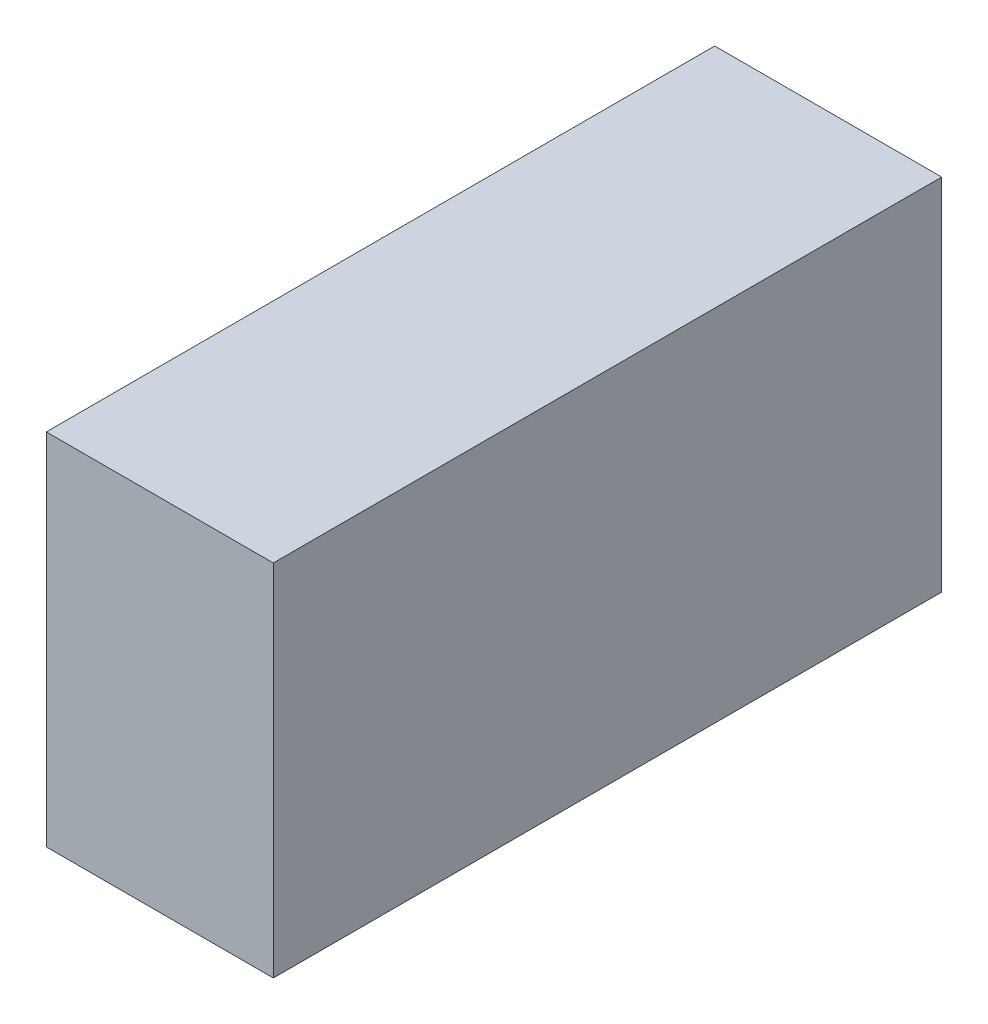
ISO-10303-21;
HEADER;
FILE_DESCRIPTION(('STEP AP214'),'2;1');
FILE_NAME('part.step','',(''),(''),'','','');
FILE_SCHEMA(('AUTOMOTIVE_DESIGN { 1 0 10303 214 1 1 1 1 }'));
ENDSEC;
DATA;
#1=APPLICATION_CONTEXT('core data for automotive mechanical design processes');
#2=APPLICATION_PROTOCOL_DEFINITION('international standard','automotive_design',2000,#1);
#3=PRODUCT_CONTEXT('',#1,'mechanical');
#4=PRODUCT('Part','Part','',(#3));
#5=PRODUCT_RELATED_PRODUCT_CATEGORY('part','',(#4));
#6=PRODUCT_DEFINITION_FORMATION('','',#4);
#7=PRODUCT_DEFINITION_CONTEXT('part definition',#1,'design');
#8=PRODUCT_DEFINITION('design','',#6,#7);
#9=PRODUCT_DEFINITION_SHAPE('','',#8);
#10=(LENGTH_UNIT() NAMED_UNIT(*) SI_UNIT(.MILLI.,.METRE.));
#11=(NAMED_UNIT(*) PLANE_ANGLE_UNIT() SI_UNIT($,.RADIAN.));
#12=(NAMED_UNIT(*) SI_UNIT($,.STERADIAN.) SOLID_ANGLE_UNIT());
#13=UNCERTAINTY_MEASURE_WITH_UNIT(LENGTH_MEASURE(1.E-05),#10,'distance_accuracy_value','');
#14=(GEOMETRIC_REPRESENTATION_CONTEXT(3) GLOBAL_UNCERTAINTY_ASSIGNED_CONTEXT((#13)) GLOBAL_UNIT_ASSIGNED_CONTEXT((#10,
#11,#12)) REPRESENTATION_CONTEXT('',''));
#15=CARTESIAN_POINT('',(0.,0.,0.));
#16=DIRECTION('',(0.,0.,1.));
#17=DIRECTION('',(1.,0.,0.));
#18=AXIS2_PLACEMENT_3D('',#15,#16,#17);
#19=CARTESIAN_POINT('',(-18.,28.5,106.));
#20=DIRECTION('',(1.,0.,0.));
#21=DIRECTION('',(0.,0.,-1.));
#22=AXIS2_PLACEMENT_3D('',#19,#20,#21);
#23=PLANE('',#22);
#24=DIRECTION('',(0.,-1.,0.));
#25=VECTOR('',#24,1.);
#26=CARTESIAN_POINT('',(-18.,28.5,0.));
#27=LINE('',#26,#25);
#28=CARTESIAN_POINT('',(-18.,28.5,0.));
#29=VERTEX_POINT('',#28);
#30=CARTESIAN_POINT('',(-18.,-28.5,0.));
#31=VERTEX_POINT('',#30);
#32=EDGE_CURVE('E96',#29,#31,#27,.T.);
#33=ORIENTED_EDGE('',*,*,#32,.T.);
#34=DIRECTION('',(0.,0.,-1.));
#35=VECTOR('',#34,1.);
#36=CARTESIAN_POINT('',(-18.,-28.5,106.));
#37=LINE('',#36,#35);
#38=CARTESIAN_POINT('',(-18.,-28.5,106.));
#39=VERTEX_POINT('',#38);
#40=EDGE_CURVE('E11',#39,#31,#37,.T.);
#41=ORIENTED_EDGE('',*,*,#40,.F.);
#42=DIRECTION('',(0.,-1.,0.));
#43=VECTOR('',#42,1.);
#44=CARTESIAN_POINT('',(-18.,28.5,106.));
#45=LINE('',#44,#43);
#46=CARTESIAN_POINT('',(-18.,28.5,106.));
#47=VERTEX_POINT('',#46);
#48=EDGE_CURVE('E84',#47,#39,#45,.T.);
#49=ORIENTED_EDGE('',*,*,#48,.F.);
#50=DIRECTION('',(0.,0.,-1.));
#51=VECTOR('',#50,1.);
#52=CARTESIAN_POINT('',(-18.,28.5,106.));
#53=LINE('',#52,#51);
#54=EDGE_CURVE('E92',#47,#29,#53,.T.);
#55=ORIENTED_EDGE('',*,*,#54,.T.);
#56=EDGE_LOOP('',(#33,#41,#49,#55));
#57=FACE_BOUND('',#56,.T.);
#58=ADVANCED_FACE('F33',(#57),#23,.F.);
#59=CARTESIAN_POINT('',(-18.,-28.5,106.));
#60=DIRECTION('',(0.,1.,0.));
#61=DIRECTION('',(0.,0.,1.));
#62=AXIS2_PLACEMENT_3D('',#59,#60,#61);
#63=PLANE('',#62);
#64=DIRECTION('',(1.,0.,0.));
#65=VECTOR('',#64,1.);
#66=CARTESIAN_POINT('',(-18.,-28.5,0.));
#67=LINE('',#66,#65);
#68=CARTESIAN_POINT('',(18.,-28.5,0.));
#69=VERTEX_POINT('',#68);
#70=EDGE_CURVE('E88',#31,#69,#67,.T.);
#71=ORIENTED_EDGE('',*,*,#70,.T.);
#72=DIRECTION('',(0.,0.,-1.));
#73=VECTOR('',#72,1.);
#74=CARTESIAN_POINT('',(18.,-28.5,106.));
#75=LINE('',#74,#73);
#76=CARTESIAN_POINT('',(18.,-28.5,106.));
#77=VERTEX_POINT('',#76);
#78=EDGE_CURVE('E41',#77,#69,#75,.T.);
#79=ORIENTED_EDGE('',*,*,#78,.F.);
#80=DIRECTION('',(1.,0.,0.));
#81=VECTOR('',#80,1.);
#82=CARTESIAN_POINT('',(-18.,-28.5,106.));
#83=LINE('',#82,#81);
#84=EDGE_CURVE('E79',#39,#77,#83,.T.);
#85=ORIENTED_EDGE('',*,*,#84,.F.);
#86=ORIENTED_EDGE('',*,*,#40,.T.);
#87=EDGE_LOOP('',(#71,#79,#85,#86));
#88=FACE_BOUND('',#87,.T.);
#89=ADVANCED_FACE('F87',(#88),#63,.F.);
#90=CARTESIAN_POINT('',(18.,-28.5,106.));
#91=DIRECTION('',(-1.,0.,0.));
#92=DIRECTION('',(0.,0.,1.));
#93=AXIS2_PLACEMENT_3D('',#90,#91,#92);
#94=PLANE('',#93);
#95=DIRECTION('',(0.,1.,0.));
#96=VECTOR('',#95,1.);
#97=CARTESIAN_POINT('',(18.,-28.5,0.));
#98=LINE('',#97,#96);
#99=CARTESIAN_POINT('',(18.,28.5,0.));
#100=VERTEX_POINT('',#99);
#101=EDGE_CURVE('E66',#69,#100,#98,.T.);
#102=ORIENTED_EDGE('',*,*,#101,.T.);
#103=DIRECTION('',(0.,0.,-1.));
#104=VECTOR('',#103,1.);
#105=CARTESIAN_POINT('',(18.,28.5,106.));
#106=LINE('',#105,#104);
#107=CARTESIAN_POINT('',(18.,28.5,106.));
#108=VERTEX_POINT('',#107);
#109=EDGE_CURVE('E89',#108,#100,#106,.T.);
#110=ORIENTED_EDGE('',*,*,#109,.F.);
#111=DIRECTION('',(0.,1.,0.));
#112=VECTOR('',#111,1.);
#113=CARTESIAN_POINT('',(18.,-28.5,106.));
#114=LINE('',#113,#112);
#115=EDGE_CURVE('E82',#77,#108,#114,.T.);
#116=ORIENTED_EDGE('',*,*,#115,.F.);
#117=ORIENTED_EDGE('',*,*,#78,.T.);
#118=EDGE_LOOP('',(#102,#110,#116,#117));
#119=FACE_BOUND('',#118,.T.);
#120=ADVANCED_FACE('F90',(#119),#94,.F.);
#121=CARTESIAN_POINT('',(18.,28.5,106.));
#122=DIRECTION('',(0.,-1.,0.));
#123=DIRECTION('',(0.,0.,-1.));
#124=AXIS2_PLACEMENT_3D('',#121,#122,#123);
#125=PLANE('',#124);
#126=DIRECTION('',(-1.,0.,0.));
#127=VECTOR('',#126,1.);
#128=CARTESIAN_POINT('',(18.,28.5,0.));
#129=LINE('',#128,#127);
#130=EDGE_CURVE('E72',#100,#29,#129,.T.);
#131=ORIENTED_EDGE('',*,*,#130,.T.);
#132=ORIENTED_EDGE('',*,*,#54,.F.);
#133=DIRECTION('',(-1.,0.,0.));
#134=VECTOR('',#133,1.);
#135=CARTESIAN_POINT('',(18.,28.5,106.));
#136=LINE('',#135,#134);
#137=EDGE_CURVE('E49',#108,#47,#136,.T.);
#138=ORIENTED_EDGE('',*,*,#137,.F.);
#139=ORIENTED_EDGE('',*,*,#109,.T.);
#140=EDGE_LOOP('',(#131,#132,#138,#139));
#141=FACE_BOUND('',#140,.T.);
#142=ADVANCED_FACE('F103',(#141),#125,.F.);
#143=CARTESIAN_POINT('',(0.,0.,106.));
#144=DIRECTION('',(0.,0.,1.));
#145=DIRECTION('',(1.,0.,0.));
#146=AXIS2_PLACEMENT_3D('',#143,#144,#145);
#147=PLANE('',#146);
#148=ORIENTED_EDGE('',*,*,#48,.T.);
#149=ORIENTED_EDGE('',*,*,#84,.T.);
#150=ORIENTED_EDGE('',*,*,#115,.T.);
#151=ORIENTED_EDGE('',*,*,#137,.T.);
#152=EDGE_LOOP('',(#148,#149,#150,#151));
#153=FACE_BOUND('',#152,.T.);
#154=ADVANCED_FACE('F80',(#153),#147,.T.);
#155=CARTESIAN_POINT('',(0.,0.,0.));
#156=DIRECTION('',(0.,0.,1.));
#157=DIRECTION('',(1.,0.,0.));
#158=AXIS2_PLACEMENT_3D('',#155,#156,#157);
#159=PLANE('',#158);
#160=ORIENTED_EDGE('',*,*,#32,.F.);
#161=ORIENTED_EDGE('',*,*,#130,.F.);
#162=ORIENTED_EDGE('',*,*,#101,.F.);
#163=ORIENTED_EDGE('',*,*,#70,.F.);
#164=EDGE_LOOP('',(#160,#161,#162,#163));
#165=FACE_BOUND('',#164,.T.);
#166=ADVANCED_FACE('F106',(#165),#159,.F.);
#167=CLOSED_SHELL('',(#58,#89,#120,#142,#154,#166));
#168=MANIFOLD_SOLID_BREP('B2',#167);
#169=ADVANCED_BREP_SHAPE_REPRESENTATION('',(#18,#168),#14);
#170=SHAPE_DEFINITION_REPRESENTATION(#9,#169);
ENDSEC;
END-ISO-10303-21;
